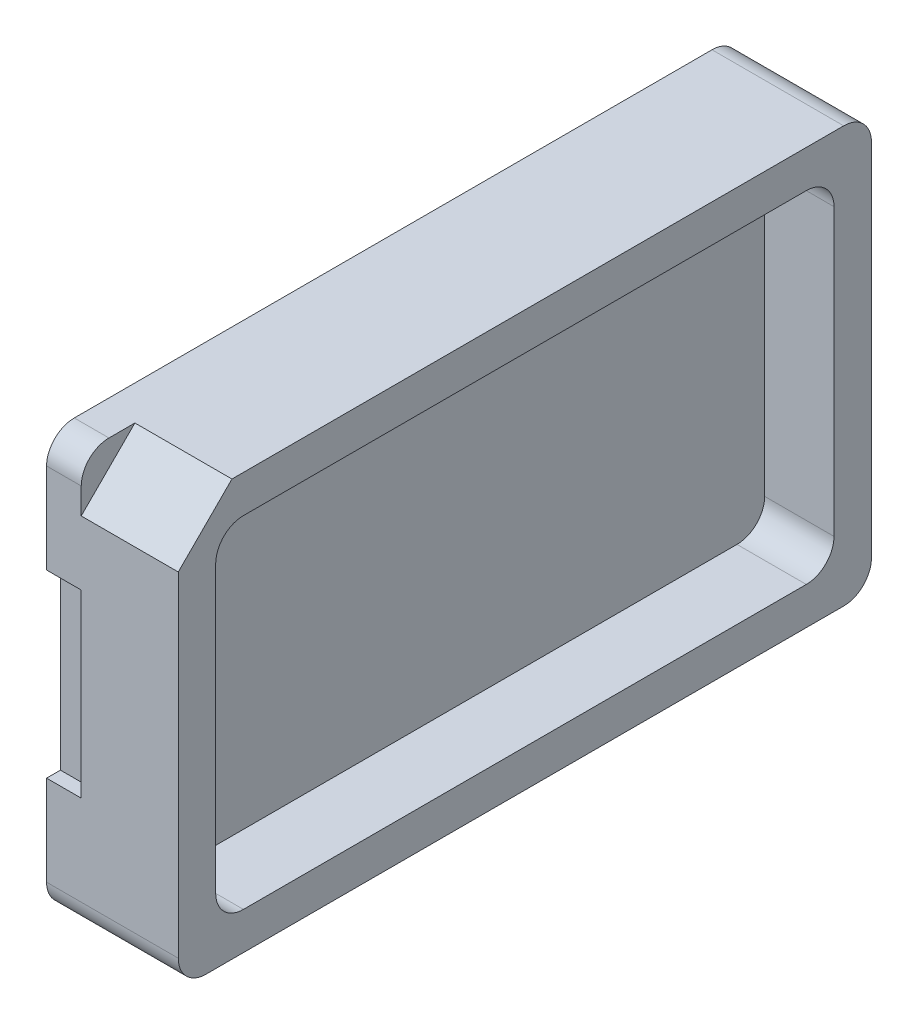
ISO-10303-21;
HEADER;
FILE_DESCRIPTION(('STEP AP214'),'2;1');
FILE_NAME('part.step','',(''),(''),'','','');
FILE_SCHEMA(('AUTOMOTIVE_DESIGN { 1 0 10303 214 1 1 1 1 }'));
ENDSEC;
DATA;
#1=APPLICATION_CONTEXT('core data for automotive mechanical design processes');
#2=APPLICATION_PROTOCOL_DEFINITION('international standard','automotive_design',2000,#1);
#3=PRODUCT_CONTEXT('',#1,'mechanical');
#4=PRODUCT('Part','Part','',(#3));
#5=PRODUCT_RELATED_PRODUCT_CATEGORY('part','',(#4));
#6=PRODUCT_DEFINITION_FORMATION('','',#4);
#7=PRODUCT_DEFINITION_CONTEXT('part definition',#1,'design');
#8=PRODUCT_DEFINITION('design','',#6,#7);
#9=PRODUCT_DEFINITION_SHAPE('','',#8);
#10=(LENGTH_UNIT() NAMED_UNIT(*) SI_UNIT(.MILLI.,.METRE.));
#11=(NAMED_UNIT(*) PLANE_ANGLE_UNIT() SI_UNIT($,.RADIAN.));
#12=(NAMED_UNIT(*) SI_UNIT($,.STERADIAN.) SOLID_ANGLE_UNIT());
#13=UNCERTAINTY_MEASURE_WITH_UNIT(LENGTH_MEASURE(1.E-05),#10,'distance_accuracy_value','');
#14=(GEOMETRIC_REPRESENTATION_CONTEXT(3) GLOBAL_UNCERTAINTY_ASSIGNED_CONTEXT((#13)) GLOBAL_UNIT_ASSIGNED_CONTEXT((#10,
#11,#12)) REPRESENTATION_CONTEXT('',''));
#15=CARTESIAN_POINT('',(0.,0.,0.));
#16=DIRECTION('',(0.,0.,1.));
#17=DIRECTION('',(1.,0.,0.));
#18=AXIS2_PLACEMENT_3D('',#15,#16,#17);
#19=CARTESIAN_POINT('',(0.45,1.03,2.03));
#20=DIRECTION('',(1.,0.,0.));
#21=DIRECTION('',(0.,0.,-1.));
#22=AXIS2_PLACEMENT_3D('',#19,#20,#21);
#23=PLANE('',#22);
#24=CARTESIAN_POINT('',(0.45,1.03,-2.03));
#25=DIRECTION('',(1.,0.,0.));
#26=DIRECTION('',(0.,0.,-1.));
#27=AXIS2_PLACEMENT_3D('',#24,#25,#26);
#28=CIRCLE('',#27,0.2);
#29=CARTESIAN_POINT('',(0.45,1.03,-2.23));
#30=VERTEX_POINT('',#29);
#31=CARTESIAN_POINT('',(0.45,1.23,-2.03));
#32=VERTEX_POINT('',#31);
#33=EDGE_CURVE('E253',#30,#32,#28,.T.);
#34=ORIENTED_EDGE('',*,*,#33,.T.);
#35=DIRECTION('',(0.,0.,-1.));
#36=VECTOR('',#35,1.);
#37=CARTESIAN_POINT('',(0.45,1.23,-2.3));
#38=LINE('',#37,#36);
#39=CARTESIAN_POINT('',(0.45,1.23,2.03));
#40=VERTEX_POINT('',#39);
#41=EDGE_CURVE('E247',#40,#32,#38,.T.);
#42=ORIENTED_EDGE('',*,*,#41,.F.);
#43=CARTESIAN_POINT('',(0.45,1.03,2.03));
#44=DIRECTION('',(1.,0.,0.));
#45=DIRECTION('',(0.,0.,-1.));
#46=AXIS2_PLACEMENT_3D('',#43,#44,#45);
#47=CIRCLE('',#46,0.2);
#48=CARTESIAN_POINT('',(0.45,1.03,2.23));
#49=VERTEX_POINT('',#48);
#50=EDGE_CURVE('E20',#40,#49,#47,.T.);
#51=ORIENTED_EDGE('',*,*,#50,.T.);
#52=DIRECTION('',(0.,1.,0.));
#53=VECTOR('',#52,1.);
#54=CARTESIAN_POINT('',(0.45,-1.3,2.23));
#55=LINE('',#54,#53);
#56=CARTESIAN_POINT('',(0.45,-1.03,2.23));
#57=VERTEX_POINT('',#56);
#58=EDGE_CURVE('E446',#57,#49,#55,.T.);
#59=ORIENTED_EDGE('',*,*,#58,.F.);
#60=CARTESIAN_POINT('',(0.45,-1.03,2.03));
#61=DIRECTION('',(1.,0.,0.));
#62=DIRECTION('',(0.,0.,-1.));
#63=AXIS2_PLACEMENT_3D('',#60,#61,#62);
#64=CIRCLE('',#63,0.2);
#65=CARTESIAN_POINT('',(0.45,-1.23,2.03));
#66=VERTEX_POINT('',#65);
#67=EDGE_CURVE('E342',#57,#66,#64,.T.);
#68=ORIENTED_EDGE('',*,*,#67,.T.);
#69=DIRECTION('',(0.,0.,1.));
#70=VECTOR('',#69,1.);
#71=CARTESIAN_POINT('',(0.45,-1.23,-2.3));
#72=LINE('',#71,#70);
#73=CARTESIAN_POINT('',(0.45,-1.23,-2.03));
#74=VERTEX_POINT('',#73);
#75=EDGE_CURVE('E346',#74,#66,#72,.T.);
#76=ORIENTED_EDGE('',*,*,#75,.F.);
#77=CARTESIAN_POINT('',(0.45,-1.03,-2.03));
#78=DIRECTION('',(1.,0.,0.));
#79=DIRECTION('',(0.,0.,-1.));
#80=AXIS2_PLACEMENT_3D('',#77,#78,#79);
#81=CIRCLE('',#80,0.2);
#82=CARTESIAN_POINT('',(0.45,-1.03,-2.23));
#83=VERTEX_POINT('',#82);
#84=EDGE_CURVE('E347',#74,#83,#81,.T.);
#85=ORIENTED_EDGE('',*,*,#84,.T.);
#86=DIRECTION('',(0.,1.,0.));
#87=VECTOR('',#86,1.);
#88=CARTESIAN_POINT('',(0.45,-1.3,-2.23));
#89=LINE('',#88,#87);
#90=EDGE_CURVE('E258',#30,#83,#89,.F.);
#91=ORIENTED_EDGE('',*,*,#90,.F.);
#92=EDGE_LOOP('',(#34,#42,#51,#59,#68,#76,#85,#91));
#93=FACE_BOUND('',#92,.T.);
#94=ADVANCED_FACE('F17',(#93),#23,.T.);
#95=CARTESIAN_POINT('',(0.45,1.03,2.03));
#96=DIRECTION('',(1.,0.,0.));
#97=DIRECTION('',(0.,0.,-1.));
#98=AXIS2_PLACEMENT_3D('',#95,#96,#97);
#99=CYLINDRICAL_SURFACE('',#98,0.2);
#100=DIRECTION('',(-1.,0.,0.));
#101=VECTOR('',#100,1.);
#102=CARTESIAN_POINT('',(0.45,1.03,2.23));
#103=LINE('',#102,#101);
#104=CARTESIAN_POINT('',(0.95,1.03,2.23));
#105=VERTEX_POINT('',#104);
#106=EDGE_CURVE('E240',#49,#105,#103,.F.);
#107=ORIENTED_EDGE('',*,*,#106,.F.);
#108=ORIENTED_EDGE('',*,*,#50,.F.);
#109=DIRECTION('',(1.,0.,0.));
#110=VECTOR('',#109,1.);
#111=CARTESIAN_POINT('',(0.45,1.23,2.03));
#112=LINE('',#111,#110);
#113=CARTESIAN_POINT('',(0.95,1.23,2.03));
#114=VERTEX_POINT('',#113);
#115=EDGE_CURVE('E238',#114,#40,#112,.F.);
#116=ORIENTED_EDGE('',*,*,#115,.F.);
#117=CARTESIAN_POINT('',(0.95,1.03,2.03));
#118=DIRECTION('',(1.,0.,0.));
#119=DIRECTION('',(0.,0.,-1.));
#120=AXIS2_PLACEMENT_3D('',#117,#118,#119);
#121=CIRCLE('',#120,0.2);
#122=EDGE_CURVE('E335',#105,#114,#121,.F.);
#123=ORIENTED_EDGE('',*,*,#122,.F.);
#124=EDGE_LOOP('',(#107,#108,#116,#123));
#125=FACE_BOUND('',#124,.T.);
#126=ADVANCED_FACE('F236',(#125),#99,.F.);
#127=CARTESIAN_POINT('',(0.45,1.23,-2.3));
#128=DIRECTION('',(0.,-1.,0.));
#129=DIRECTION('',(0.,0.,-1.));
#130=AXIS2_PLACEMENT_3D('',#127,#128,#129);
#131=PLANE('',#130);
#132=ORIENTED_EDGE('',*,*,#41,.T.);
#133=DIRECTION('',(1.,0.,0.));
#134=VECTOR('',#133,1.);
#135=CARTESIAN_POINT('',(0.45,1.23,-2.03));
#136=LINE('',#135,#134);
#137=CARTESIAN_POINT('',(0.95,1.23,-2.03));
#138=VERTEX_POINT('',#137);
#139=EDGE_CURVE('E255',#32,#138,#136,.T.);
#140=ORIENTED_EDGE('',*,*,#139,.T.);
#141=DIRECTION('',(0.,0.,-1.));
#142=VECTOR('',#141,1.);
#143=CARTESIAN_POINT('',(0.95,1.23,-2.3));
#144=LINE('',#143,#142);
#145=EDGE_CURVE('E249',#114,#138,#144,.T.);
#146=ORIENTED_EDGE('',*,*,#145,.F.);
#147=ORIENTED_EDGE('',*,*,#115,.T.);
#148=EDGE_LOOP('',(#132,#140,#146,#147));
#149=FACE_BOUND('',#148,.T.);
#150=ADVANCED_FACE('F245',(#149),#131,.T.);
#151=CARTESIAN_POINT('',(0.45,1.03,-2.03));
#152=DIRECTION('',(1.,0.,0.));
#153=DIRECTION('',(0.,0.,-1.));
#154=AXIS2_PLACEMENT_3D('',#151,#152,#153);
#155=CYLINDRICAL_SURFACE('',#154,0.2);
#156=ORIENTED_EDGE('',*,*,#139,.F.);
#157=ORIENTED_EDGE('',*,*,#33,.F.);
#158=DIRECTION('',(1.,0.,0.));
#159=VECTOR('',#158,1.);
#160=CARTESIAN_POINT('',(0.45,1.03,-2.23));
#161=LINE('',#160,#159);
#162=CARTESIAN_POINT('',(0.95,1.03,-2.23));
#163=VERTEX_POINT('',#162);
#164=EDGE_CURVE('E354',#163,#30,#161,.F.);
#165=ORIENTED_EDGE('',*,*,#164,.F.);
#166=CARTESIAN_POINT('',(0.95,1.03,-2.03));
#167=DIRECTION('',(1.,0.,0.));
#168=DIRECTION('',(0.,0.,-1.));
#169=AXIS2_PLACEMENT_3D('',#166,#167,#168);
#170=CIRCLE('',#169,0.2);
#171=EDGE_CURVE('E333',#138,#163,#170,.F.);
#172=ORIENTED_EDGE('',*,*,#171,.F.);
#173=EDGE_LOOP('',(#156,#157,#165,#172));
#174=FACE_BOUND('',#173,.T.);
#175=ADVANCED_FACE('F742',(#174),#155,.F.);
#176=CARTESIAN_POINT('',(0.45,-1.3,-2.23));
#177=DIRECTION('',(0.,0.,1.));
#178=DIRECTION('',(1.,0.,0.));
#179=AXIS2_PLACEMENT_3D('',#176,#177,#178);
#180=PLANE('',#179);
#181=ORIENTED_EDGE('',*,*,#90,.T.);
#182=DIRECTION('',(1.,0.,0.));
#183=VECTOR('',#182,1.);
#184=CARTESIAN_POINT('',(0.45,-1.03,-2.23));
#185=LINE('',#184,#183);
#186=CARTESIAN_POINT('',(0.95,-1.03,-2.23));
#187=VERTEX_POINT('',#186);
#188=EDGE_CURVE('E349',#83,#187,#185,.T.);
#189=ORIENTED_EDGE('',*,*,#188,.T.);
#190=DIRECTION('',(0.,1.,0.));
#191=VECTOR('',#190,1.);
#192=CARTESIAN_POINT('',(0.95,-1.3,-2.23));
#193=LINE('',#192,#191);
#194=EDGE_CURVE('E332',#163,#187,#193,.F.);
#195=ORIENTED_EDGE('',*,*,#194,.F.);
#196=ORIENTED_EDGE('',*,*,#164,.T.);
#197=EDGE_LOOP('',(#181,#189,#195,#196));
#198=FACE_BOUND('',#197,.T.);
#199=ADVANCED_FACE('F738',(#198),#180,.T.);
#200=CARTESIAN_POINT('',(0.45,-1.03,-2.03));
#201=DIRECTION('',(1.,0.,0.));
#202=DIRECTION('',(0.,0.,-1.));
#203=AXIS2_PLACEMENT_3D('',#200,#201,#202);
#204=CYLINDRICAL_SURFACE('',#203,0.2);
#205=ORIENTED_EDGE('',*,*,#188,.F.);
#206=ORIENTED_EDGE('',*,*,#84,.F.);
#207=DIRECTION('',(1.,0.,0.));
#208=VECTOR('',#207,1.);
#209=CARTESIAN_POINT('',(0.45,-1.23,-2.03));
#210=LINE('',#209,#208);
#211=CARTESIAN_POINT('',(0.95,-1.23,-2.03));
#212=VERTEX_POINT('',#211);
#213=EDGE_CURVE('E352',#212,#74,#210,.F.);
#214=ORIENTED_EDGE('',*,*,#213,.F.);
#215=CARTESIAN_POINT('',(0.95,-1.03,-2.03));
#216=DIRECTION('',(1.,0.,0.));
#217=DIRECTION('',(0.,0.,-1.));
#218=AXIS2_PLACEMENT_3D('',#215,#216,#217);
#219=CIRCLE('',#218,0.2);
#220=EDGE_CURVE('E330',#187,#212,#219,.F.);
#221=ORIENTED_EDGE('',*,*,#220,.F.);
#222=EDGE_LOOP('',(#205,#206,#214,#221));
#223=FACE_BOUND('',#222,.T.);
#224=ADVANCED_FACE('F735',(#223),#204,.F.);
#225=CARTESIAN_POINT('',(0.45,-1.23,-2.3));
#226=DIRECTION('',(0.,1.,0.));
#227=DIRECTION('',(0.,0.,1.));
#228=AXIS2_PLACEMENT_3D('',#225,#226,#227);
#229=PLANE('',#228);
#230=ORIENTED_EDGE('',*,*,#75,.T.);
#231=DIRECTION('',(1.,0.,0.));
#232=VECTOR('',#231,1.);
#233=CARTESIAN_POINT('',(0.45,-1.23,2.03));
#234=LINE('',#233,#232);
#235=CARTESIAN_POINT('',(0.95,-1.23,2.03));
#236=VERTEX_POINT('',#235);
#237=EDGE_CURVE('E345',#66,#236,#234,.T.);
#238=ORIENTED_EDGE('',*,*,#237,.T.);
#239=DIRECTION('',(0.,0.,-1.));
#240=VECTOR('',#239,1.);
#241=CARTESIAN_POINT('',(0.95,-1.23,-2.3));
#242=LINE('',#241,#240);
#243=EDGE_CURVE('E329',#212,#236,#242,.F.);
#244=ORIENTED_EDGE('',*,*,#243,.F.);
#245=ORIENTED_EDGE('',*,*,#213,.T.);
#246=EDGE_LOOP('',(#230,#238,#244,#245));
#247=FACE_BOUND('',#246,.T.);
#248=ADVANCED_FACE('F729',(#247),#229,.T.);
#249=CARTESIAN_POINT('',(0.45,-1.03,2.03));
#250=DIRECTION('',(1.,0.,0.));
#251=DIRECTION('',(0.,0.,-1.));
#252=AXIS2_PLACEMENT_3D('',#249,#250,#251);
#253=CYLINDRICAL_SURFACE('',#252,0.2);
#254=ORIENTED_EDGE('',*,*,#237,.F.);
#255=ORIENTED_EDGE('',*,*,#67,.F.);
#256=DIRECTION('',(-1.,0.,0.));
#257=VECTOR('',#256,1.);
#258=CARTESIAN_POINT('',(0.45,-1.03,2.23));
#259=LINE('',#258,#257);
#260=CARTESIAN_POINT('',(0.95,-1.03,2.23));
#261=VERTEX_POINT('',#260);
#262=EDGE_CURVE('E448',#261,#57,#259,.T.);
#263=ORIENTED_EDGE('',*,*,#262,.F.);
#264=CARTESIAN_POINT('',(0.95,-1.03,2.03));
#265=DIRECTION('',(1.,0.,0.));
#266=DIRECTION('',(0.,0.,-1.));
#267=AXIS2_PLACEMENT_3D('',#264,#265,#266);
#268=CIRCLE('',#267,0.2);
#269=EDGE_CURVE('E326',#236,#261,#268,.F.);
#270=ORIENTED_EDGE('',*,*,#269,.F.);
#271=EDGE_LOOP('',(#254,#255,#263,#270));
#272=FACE_BOUND('',#271,.T.);
#273=ADVANCED_FACE('F719',(#272),#253,.F.);
#274=CARTESIAN_POINT('',(0.45,-1.3,2.23));
#275=DIRECTION('',(0.,0.,-1.));
#276=DIRECTION('',(-1.,0.,0.));
#277=AXIS2_PLACEMENT_3D('',#274,#275,#276);
#278=PLANE('',#277);
#279=ORIENTED_EDGE('',*,*,#58,.T.);
#280=ORIENTED_EDGE('',*,*,#106,.T.);
#281=DIRECTION('',(0.,1.,0.));
#282=VECTOR('',#281,1.);
#283=CARTESIAN_POINT('',(0.95,-1.3,2.23));
#284=LINE('',#283,#282);
#285=EDGE_CURVE('E328',#261,#105,#284,.T.);
#286=ORIENTED_EDGE('',*,*,#285,.F.);
#287=ORIENTED_EDGE('',*,*,#262,.T.);
#288=EDGE_LOOP('',(#279,#280,#286,#287));
#289=FACE_BOUND('',#288,.T.);
#290=ADVANCED_FACE('F721',(#289),#278,.T.);
#291=CARTESIAN_POINT('',(0.95,-1.3,2.5));
#292=DIRECTION('',(0.,0.,-1.));
#293=DIRECTION('',(-1.,0.,0.));
#294=AXIS2_PLACEMENT_3D('',#291,#292,#293);
#295=PLANE('',#294);
#296=DIRECTION('',(0.,1.,0.));
#297=VECTOR('',#296,1.);
#298=CARTESIAN_POINT('',(0.,-1.3,2.5));
#299=LINE('',#298,#297);
#300=CARTESIAN_POINT('',(0.,-1.3,2.5));
#301=VERTEX_POINT('',#300);
#302=CARTESIAN_POINT('',(0.,-0.65,2.5));
#303=VERTEX_POINT('',#302);
#304=EDGE_CURVE('E394',#301,#303,#299,.T.);
#305=ORIENTED_EDGE('',*,*,#304,.F.);
#306=DIRECTION('',(-1.,0.,0.));
#307=VECTOR('',#306,1.);
#308=CARTESIAN_POINT('',(0.95,-1.3,2.5));
#309=LINE('',#308,#307);
#310=CARTESIAN_POINT('',(0.95,-1.3,2.5));
#311=VERTEX_POINT('',#310);
#312=EDGE_CURVE('E397',#311,#301,#309,.T.);
#313=ORIENTED_EDGE('',*,*,#312,.F.);
#314=DIRECTION('',(0.,1.,0.));
#315=VECTOR('',#314,1.);
#316=CARTESIAN_POINT('',(0.95,-1.3,2.5));
#317=LINE('',#316,#315);
#318=CARTESIAN_POINT('',(0.95,1.112842712475,2.5));
#319=VERTEX_POINT('',#318);
#320=EDGE_CURVE('E505',#319,#311,#317,.F.);
#321=ORIENTED_EDGE('',*,*,#320,.F.);
#322=DIRECTION('',(-1.,0.,0.));
#323=VECTOR('',#322,1.);
#324=CARTESIAN_POINT('',(0.95,1.112842712475,2.5));
#325=LINE('',#324,#323);
#326=CARTESIAN_POINT('',(0.25,1.112842712475,2.5));
#327=VERTEX_POINT('',#326);
#328=EDGE_CURVE('E409',#327,#319,#325,.F.);
#329=ORIENTED_EDGE('',*,*,#328,.F.);
#330=DIRECTION('',(0.,1.,0.));
#331=VECTOR('',#330,1.);
#332=CARTESIAN_POINT('',(0.25,-1.3,2.5));
#333=LINE('',#332,#331);
#334=CARTESIAN_POINT('',(0.25,1.3,2.5));
#335=VERTEX_POINT('',#334);
#336=EDGE_CURVE('E406',#335,#327,#333,.F.);
#337=ORIENTED_EDGE('',*,*,#336,.F.);
#338=DIRECTION('',(-1.,0.,0.));
#339=VECTOR('',#338,1.);
#340=CARTESIAN_POINT('',(0.95,1.3,2.5));
#341=LINE('',#340,#339);
#342=CARTESIAN_POINT('',(0.,1.3,2.5));
#343=VERTEX_POINT('',#342);
#344=EDGE_CURVE('E410',#343,#335,#341,.F.);
#345=ORIENTED_EDGE('',*,*,#344,.F.);
#346=DIRECTION('',(0.,1.,0.));
#347=VECTOR('',#346,1.);
#348=CARTESIAN_POINT('',(0.,-1.3,2.5));
#349=LINE('',#348,#347);
#350=CARTESIAN_POINT('',(0.,0.65,2.5));
#351=VERTEX_POINT('',#350);
#352=EDGE_CURVE('E415',#351,#343,#349,.T.);
#353=ORIENTED_EDGE('',*,*,#352,.F.);
#354=DIRECTION('',(-1.,0.,0.));
#355=VECTOR('',#354,1.);
#356=CARTESIAN_POINT('',(0.95,0.65,2.5));
#357=LINE('',#356,#355);
#358=CARTESIAN_POINT('',(0.25,0.65,2.5));
#359=VERTEX_POINT('',#358);
#360=EDGE_CURVE('E418',#359,#351,#357,.T.);
#361=ORIENTED_EDGE('',*,*,#360,.F.);
#362=DIRECTION('',(0.,1.,0.));
#363=VECTOR('',#362,1.);
#364=CARTESIAN_POINT('',(0.25,-1.3,2.5));
#365=LINE('',#364,#363);
#366=CARTESIAN_POINT('',(0.25,-0.65,2.5));
#367=VERTEX_POINT('',#366);
#368=EDGE_CURVE('E427',#367,#359,#365,.T.);
#369=ORIENTED_EDGE('',*,*,#368,.F.);
#370=DIRECTION('',(-1.,0.,0.));
#371=VECTOR('',#370,1.);
#372=CARTESIAN_POINT('',(0.95,-0.65,2.5));
#373=LINE('',#372,#371);
#374=EDGE_CURVE('E383',#303,#367,#373,.F.);
#375=ORIENTED_EDGE('',*,*,#374,.F.);
#376=EDGE_LOOP('',(#305,#313,#321,#329,#337,#345,#353,#361,#369,#375));
#377=FACE_BOUND('',#376,.T.);
#378=ADVANCED_FACE('F575',(#377),#295,.F.);
#379=CARTESIAN_POINT('',(0.95,-1.3,-2.5));
#380=DIRECTION('',(0.,0.,1.));
#381=DIRECTION('',(1.,0.,0.));
#382=AXIS2_PLACEMENT_3D('',#379,#380,#381);
#383=PLANE('',#382);
#384=DIRECTION('',(0.,1.,0.));
#385=VECTOR('',#384,1.);
#386=CARTESIAN_POINT('',(0.25,0.,-2.5));
#387=LINE('',#386,#385);
#388=CARTESIAN_POINT('',(0.25,-0.65,-2.5));
#389=VERTEX_POINT('',#388);
#390=CARTESIAN_POINT('',(0.25,0.65,-2.5));
#391=VERTEX_POINT('',#390);
#392=EDGE_CURVE('E340',#389,#391,#387,.T.);
#393=ORIENTED_EDGE('',*,*,#392,.T.);
#394=DIRECTION('',(1.,0.,0.));
#395=VECTOR('',#394,1.);
#396=CARTESIAN_POINT('',(0.95,0.65,-2.5));
#397=LINE('',#396,#395);
#398=CARTESIAN_POINT('',(0.,0.65,-2.5));
#399=VERTEX_POINT('',#398);
#400=EDGE_CURVE('E367',#399,#391,#397,.T.);
#401=ORIENTED_EDGE('',*,*,#400,.F.);
#402=DIRECTION('',(0.,1.,0.));
#403=VECTOR('',#402,1.);
#404=CARTESIAN_POINT('',(0.,-1.3,-2.5));
#405=LINE('',#404,#403);
#406=CARTESIAN_POINT('',(0.,1.3,-2.5));
#407=VERTEX_POINT('',#406);
#408=EDGE_CURVE('E364',#407,#399,#405,.F.);
#409=ORIENTED_EDGE('',*,*,#408,.F.);
#410=DIRECTION('',(1.,0.,0.));
#411=VECTOR('',#410,1.);
#412=CARTESIAN_POINT('',(0.95,1.3,-2.5));
#413=LINE('',#412,#411);
#414=CARTESIAN_POINT('',(0.95,1.3,-2.5));
#415=VERTEX_POINT('',#414);
#416=EDGE_CURVE('E368',#415,#407,#413,.F.);
#417=ORIENTED_EDGE('',*,*,#416,.F.);
#418=DIRECTION('',(0.,1.,0.));
#419=VECTOR('',#418,1.);
#420=CARTESIAN_POINT('',(0.95,-1.3,-2.5));
#421=LINE('',#420,#419);
#422=CARTESIAN_POINT('',(0.95,-1.3,-2.5));
#423=VERTEX_POINT('',#422);
#424=EDGE_CURVE('E489',#423,#415,#421,.T.);
#425=ORIENTED_EDGE('',*,*,#424,.F.);
#426=DIRECTION('',(1.,0.,0.));
#427=VECTOR('',#426,1.);
#428=CARTESIAN_POINT('',(0.95,-1.3,-2.5));
#429=LINE('',#428,#427);
#430=CARTESIAN_POINT('',(0.,-1.3,-2.5));
#431=VERTEX_POINT('',#430);
#432=EDGE_CURVE('E382',#431,#423,#429,.T.);
#433=ORIENTED_EDGE('',*,*,#432,.F.);
#434=DIRECTION('',(0.,1.,0.));
#435=VECTOR('',#434,1.);
#436=CARTESIAN_POINT('',(0.,-1.3,-2.5));
#437=LINE('',#436,#435);
#438=CARTESIAN_POINT('',(0.,-0.65,-2.5));
#439=VERTEX_POINT('',#438);
#440=EDGE_CURVE('E379',#439,#431,#437,.F.);
#441=ORIENTED_EDGE('',*,*,#440,.F.);
#442=DIRECTION('',(1.,0.,0.));
#443=VECTOR('',#442,1.);
#444=CARTESIAN_POINT('',(0.95,-0.65,-2.5));
#445=LINE('',#444,#443);
#446=EDGE_CURVE('E341',#389,#439,#445,.F.);
#447=ORIENTED_EDGE('',*,*,#446,.F.);
#448=EDGE_LOOP('',(#393,#401,#409,#417,#425,#433,#441,#447));
#449=FACE_BOUND('',#448,.T.);
#450=ADVANCED_FACE('F592',(#449),#383,.F.);
#451=CARTESIAN_POINT('',(0.25,-0.345,0.4));
#452=DIRECTION('',(-1.,0.,0.));
#453=DIRECTION('',(0.,0.,1.));
#454=AXIS2_PLACEMENT_3D('',#451,#452,#453);
#455=PLANE('',#454);
#456=CARTESIAN_POINT('',(0.25,-0.345,-1.3));
#457=DIRECTION('',(-1.,0.,0.));
#458=DIRECTION('',(0.,0.,1.));
#459=AXIS2_PLACEMENT_3D('',#456,#457,#458);
#460=CIRCLE('',#459,0.2);
#461=CARTESIAN_POINT('',(0.25,-0.345,-1.5));
#462=VERTEX_POINT('',#461);
#463=CARTESIAN_POINT('',(0.25,-0.545,-1.3));
#464=VERTEX_POINT('',#463);
#465=EDGE_CURVE('E311',#462,#464,#460,.T.);
#466=ORIENTED_EDGE('',*,*,#465,.T.);
#467=DIRECTION('',(0.,0.,1.));
#468=VECTOR('',#467,1.);
#469=CARTESIAN_POINT('',(0.25,-0.545,-1.3));
#470=LINE('',#469,#468);
#471=CARTESIAN_POINT('',(0.25,-0.545,0.4));
#472=VERTEX_POINT('',#471);
#473=EDGE_CURVE('E314',#472,#464,#470,.F.);
#474=ORIENTED_EDGE('',*,*,#473,.F.);
#475=CARTESIAN_POINT('',(0.25,-0.345,0.4));
#476=DIRECTION('',(-1.,0.,0.));
#477=DIRECTION('',(0.,0.,1.));
#478=AXIS2_PLACEMENT_3D('',#475,#476,#477);
#479=CIRCLE('',#478,0.2);
#480=CARTESIAN_POINT('',(0.25,-0.345,0.6));
#481=VERTEX_POINT('',#480);
#482=EDGE_CURVE('E338',#472,#481,#479,.T.);
#483=ORIENTED_EDGE('',*,*,#482,.T.);
#484=DIRECTION('',(0.,1.,0.));
#485=VECTOR('',#484,1.);
#486=CARTESIAN_POINT('',(0.25,-0.345,0.6));
#487=LINE('',#486,#485);
#488=CARTESIAN_POINT('',(0.25,0.545,0.6));
#489=VERTEX_POINT('',#488);
#490=EDGE_CURVE('E442',#489,#481,#487,.F.);
#491=ORIENTED_EDGE('',*,*,#490,.F.);
#492=CARTESIAN_POINT('',(0.25,0.545,0.4));
#493=DIRECTION('',(-1.,0.,0.));
#494=DIRECTION('',(0.,0.,1.));
#495=AXIS2_PLACEMENT_3D('',#492,#493,#494);
#496=CIRCLE('',#495,0.2);
#497=CARTESIAN_POINT('',(0.25,0.745,0.4));
#498=VERTEX_POINT('',#497);
#499=EDGE_CURVE('E321',#489,#498,#496,.T.);
#500=ORIENTED_EDGE('',*,*,#499,.T.);
#501=DIRECTION('',(0.,0.,-1.));
#502=VECTOR('',#501,1.);
#503=CARTESIAN_POINT('',(0.25,0.745,-1.3));
#504=LINE('',#503,#502);
#505=CARTESIAN_POINT('',(0.25,0.745,-1.3));
#506=VERTEX_POINT('',#505);
#507=EDGE_CURVE('E324',#506,#498,#504,.F.);
#508=ORIENTED_EDGE('',*,*,#507,.F.);
#509=CARTESIAN_POINT('',(0.25,0.545,-1.3));
#510=DIRECTION('',(-1.,0.,0.));
#511=DIRECTION('',(0.,0.,1.));
#512=AXIS2_PLACEMENT_3D('',#509,#510,#511);
#513=CIRCLE('',#512,0.2);
#514=CARTESIAN_POINT('',(0.25,0.545,-1.5));
#515=VERTEX_POINT('',#514);
#516=EDGE_CURVE('E316',#506,#515,#513,.T.);
#517=ORIENTED_EDGE('',*,*,#516,.T.);
#518=DIRECTION('',(0.,1.,0.));
#519=VECTOR('',#518,1.);
#520=CARTESIAN_POINT('',(0.25,-0.345,-1.5));
#521=LINE('',#520,#519);
#522=EDGE_CURVE('E319',#462,#515,#521,.T.);
#523=ORIENTED_EDGE('',*,*,#522,.F.);
#524=EDGE_LOOP('',(#466,#474,#483,#491,#500,#508,#517,#523));
#525=FACE_BOUND('',#524,.T.);
#526=ADVANCED_FACE('F611',(#525),#455,.T.);
#527=CARTESIAN_POINT('',(0.25,0.,0.));
#528=DIRECTION('',(1.,0.,0.));
#529=DIRECTION('',(0.,0.,-1.));
#530=AXIS2_PLACEMENT_3D('',#527,#528,#529);
#531=PLANE('',#530);
#532=DIRECTION('',(0.,1.,0.));
#533=VECTOR('',#532,1.);
#534=CARTESIAN_POINT('',(0.25,-0.65,-2.4));
#535=LINE('',#534,#533);
#536=CARTESIAN_POINT('',(0.25,0.65,-2.4));
#537=VERTEX_POINT('',#536);
#538=CARTESIAN_POINT('',(0.25,-0.65,-2.4));
#539=VERTEX_POINT('',#538);
#540=EDGE_CURVE('E536',#537,#539,#535,.F.);
#541=ORIENTED_EDGE('',*,*,#540,.F.);
#542=DIRECTION('',(0.,0.,-1.));
#543=VECTOR('',#542,1.);
#544=CARTESIAN_POINT('',(0.25,0.65,0.));
#545=LINE('',#544,#543);
#546=EDGE_CURVE('E337',#391,#537,#545,.F.);
#547=ORIENTED_EDGE('',*,*,#546,.F.);
#548=ORIENTED_EDGE('',*,*,#392,.F.);
#549=DIRECTION('',(0.,0.,1.));
#550=VECTOR('',#549,1.);
#551=CARTESIAN_POINT('',(0.25,-0.65,-2.8));
#552=LINE('',#551,#550);
#553=EDGE_CURVE('E533',#539,#389,#552,.F.);
#554=ORIENTED_EDGE('',*,*,#553,.F.);
#555=EDGE_LOOP('',(#541,#547,#548,#554));
#556=FACE_BOUND('',#555,.T.);
#557=ADVANCED_FACE('F608',(#556),#531,.F.);
#558=CARTESIAN_POINT('',(0.95,-1.3,-2.3));
#559=DIRECTION('',(1.,0.,0.));
#560=DIRECTION('',(0.,0.,-1.));
#561=AXIS2_PLACEMENT_3D('',#558,#559,#560);
#562=PLANE('',#561);
#563=ORIENTED_EDGE('',*,*,#424,.T.);
#564=CARTESIAN_POINT('',(0.95,1.3,-2.3));
#565=DIRECTION('',(-1.,0.,0.));
#566=DIRECTION('',(0.,0.,1.));
#567=AXIS2_PLACEMENT_3D('',#564,#565,#566);
#568=CIRCLE('',#567,0.2);
#569=CARTESIAN_POINT('',(0.95,1.5,-2.3));
#570=VERTEX_POINT('',#569);
#571=EDGE_CURVE('E297',#570,#415,#568,.T.);
#572=ORIENTED_EDGE('',*,*,#571,.F.);
#573=DIRECTION('',(0.,0.,-1.));
#574=VECTOR('',#573,1.);
#575=CARTESIAN_POINT('',(0.95,1.5,2.3));
#576=LINE('',#575,#574);
#577=CARTESIAN_POINT('',(0.95,1.5,2.112842712475));
#578=VERTEX_POINT('',#577);
#579=EDGE_CURVE('E494',#570,#578,#576,.F.);
#580=ORIENTED_EDGE('',*,*,#579,.T.);
#581=DIRECTION('',(0.,-0.707106781186548,0.707106781186548));
#582=VECTOR('',#581,1.);
#583=CARTESIAN_POINT('',(0.95,1.112842712475,2.5));
#584=LINE('',#583,#582);
#585=EDGE_CURVE('E485',#319,#578,#584,.F.);
#586=ORIENTED_EDGE('',*,*,#585,.F.);
#587=ORIENTED_EDGE('',*,*,#320,.T.);
#588=CARTESIAN_POINT('',(0.95,-1.3,2.3));
#589=DIRECTION('',(-1.,0.,0.));
#590=DIRECTION('',(0.,0.,1.));
#591=AXIS2_PLACEMENT_3D('',#588,#589,#590);
#592=CIRCLE('',#591,0.2);
#593=CARTESIAN_POINT('',(0.95,-1.5,2.3));
#594=VERTEX_POINT('',#593);
#595=EDGE_CURVE('E306',#594,#311,#592,.T.);
#596=ORIENTED_EDGE('',*,*,#595,.F.);
#597=DIRECTION('',(0.,0.,1.));
#598=VECTOR('',#597,1.);
#599=CARTESIAN_POINT('',(0.95,-1.5,2.3));
#600=LINE('',#599,#598);
#601=CARTESIAN_POINT('',(0.95,-1.5,-2.3));
#602=VERTEX_POINT('',#601);
#603=EDGE_CURVE('E305',#594,#602,#600,.F.);
#604=ORIENTED_EDGE('',*,*,#603,.T.);
#605=CARTESIAN_POINT('',(0.95,-1.3,-2.3));
#606=DIRECTION('',(-1.,0.,0.));
#607=DIRECTION('',(0.,0.,1.));
#608=AXIS2_PLACEMENT_3D('',#605,#606,#607);
#609=CIRCLE('',#608,0.2);
#610=EDGE_CURVE('E302',#423,#602,#609,.T.);
#611=ORIENTED_EDGE('',*,*,#610,.F.);
#612=EDGE_LOOP('',(#563,#572,#580,#586,#587,#596,#604,#611));
#613=FACE_BOUND('',#612,.T.);
#614=ORIENTED_EDGE('',*,*,#269,.T.);
#615=ORIENTED_EDGE('',*,*,#285,.T.);
#616=ORIENTED_EDGE('',*,*,#122,.T.);
#617=ORIENTED_EDGE('',*,*,#145,.T.);
#618=ORIENTED_EDGE('',*,*,#171,.T.);
#619=ORIENTED_EDGE('',*,*,#194,.T.);
#620=ORIENTED_EDGE('',*,*,#220,.T.);
#621=ORIENTED_EDGE('',*,*,#243,.T.);
#622=EDGE_LOOP('',(#614,#615,#616,#617,#618,#619,#620,#621));
#623=FACE_BOUND('',#622,.T.);
#624=ADVANCED_FACE('F610',(#613,#623),#562,.T.);
#625=CARTESIAN_POINT('',(0.95,1.112842712475,2.5));
#626=DIRECTION('',(0.,0.707106781186548,0.707106781186548));
#627=DIRECTION('',(0.,-0.707106781186548,0.707106781186548));
#628=AXIS2_PLACEMENT_3D('',#625,#626,#627);
#629=PLANE('',#628);
#630=ORIENTED_EDGE('',*,*,#585,.T.);
#631=DIRECTION('',(1.,0.,0.));
#632=VECTOR('',#631,1.);
#633=CARTESIAN_POINT('',(0.95,1.5,2.112842712475));
#634=LINE('',#633,#632);
#635=CARTESIAN_POINT('',(0.25,1.5,2.112842712475));
#636=VERTEX_POINT('',#635);
#637=EDGE_CURVE('E296',#578,#636,#634,.F.);
#638=ORIENTED_EDGE('',*,*,#637,.T.);
#639=DIRECTION('',(0.,-0.707106781186548,0.707106781186547));
#640=VECTOR('',#639,1.);
#641=CARTESIAN_POINT('',(0.25,1.5,2.112842712475));
#642=LINE('',#641,#640);
#643=EDGE_CURVE('E443',#636,#327,#642,.T.);
#644=ORIENTED_EDGE('',*,*,#643,.T.);
#645=ORIENTED_EDGE('',*,*,#328,.T.);
#646=EDGE_LOOP('',(#630,#638,#644,#645));
#647=FACE_BOUND('',#646,.T.);
#648=ADVANCED_FACE('F618',(#647),#629,.T.);
#649=CARTESIAN_POINT('',(0.25,0.,0.));
#650=DIRECTION('',(-1.,0.,0.));
#651=DIRECTION('',(0.,0.,1.));
#652=AXIS2_PLACEMENT_3D('',#649,#650,#651);
#653=PLANE('',#652);
#654=ORIENTED_EDGE('',*,*,#336,.T.);
#655=ORIENTED_EDGE('',*,*,#643,.F.);
#656=DIRECTION('',(0.,0.,-1.));
#657=VECTOR('',#656,1.);
#658=CARTESIAN_POINT('',(0.25,1.5,2.3));
#659=LINE('',#658,#657);
#660=CARTESIAN_POINT('',(0.25,1.5,2.3));
#661=VERTEX_POINT('',#660);
#662=EDGE_CURVE('E300',#636,#661,#659,.F.);
#663=ORIENTED_EDGE('',*,*,#662,.T.);
#664=CARTESIAN_POINT('',(0.25,1.3,2.3));
#665=DIRECTION('',(-1.,0.,0.));
#666=DIRECTION('',(0.,0.,1.));
#667=AXIS2_PLACEMENT_3D('',#664,#665,#666);
#668=CIRCLE('',#667,0.2);
#669=EDGE_CURVE('E293',#335,#661,#668,.T.);
#670=ORIENTED_EDGE('',*,*,#669,.F.);
#671=EDGE_LOOP('',(#654,#655,#663,#670));
#672=FACE_BOUND('',#671,.T.);
#673=ADVANCED_FACE('F695',(#672),#653,.F.);
#674=CARTESIAN_POINT('',(0.25,0.,0.));
#675=DIRECTION('',(1.,0.,0.));
#676=DIRECTION('',(0.,0.,-1.));
#677=AXIS2_PLACEMENT_3D('',#674,#675,#676);
#678=PLANE('',#677);
#679=DIRECTION('',(0.,1.,0.));
#680=VECTOR('',#679,1.);
#681=CARTESIAN_POINT('',(0.25,-0.65,2.4));
#682=LINE('',#681,#680);
#683=CARTESIAN_POINT('',(0.25,-0.65,2.4));
#684=VERTEX_POINT('',#683);
#685=CARTESIAN_POINT('',(0.25,0.65,2.4));
#686=VERTEX_POINT('',#685);
#687=EDGE_CURVE('E433',#684,#686,#682,.T.);
#688=ORIENTED_EDGE('',*,*,#687,.F.);
#689=DIRECTION('',(0.,0.,-1.));
#690=VECTOR('',#689,1.);
#691=CARTESIAN_POINT('',(0.25,-0.65,0.));
#692=LINE('',#691,#690);
#693=EDGE_CURVE('E440',#367,#684,#692,.T.);
#694=ORIENTED_EDGE('',*,*,#693,.F.);
#695=ORIENTED_EDGE('',*,*,#368,.T.);
#696=DIRECTION('',(0.,0.,-1.));
#697=VECTOR('',#696,1.);
#698=CARTESIAN_POINT('',(0.25,0.65,2.4));
#699=LINE('',#698,#697);
#700=EDGE_CURVE('E430',#686,#359,#699,.F.);
#701=ORIENTED_EDGE('',*,*,#700,.F.);
#702=EDGE_LOOP('',(#688,#694,#695,#701));
#703=FACE_BOUND('',#702,.T.);
#704=ADVANCED_FACE('F691',(#703),#678,.F.);
#705=CARTESIAN_POINT('',(0.25,-0.345,0.6));
#706=DIRECTION('',(0.,0.,-1.));
#707=DIRECTION('',(-1.,0.,0.));
#708=AXIS2_PLACEMENT_3D('',#705,#706,#707);
#709=PLANE('',#708);
#710=ORIENTED_EDGE('',*,*,#490,.T.);
#711=DIRECTION('',(-1.,0.,0.));
#712=VECTOR('',#711,1.);
#713=CARTESIAN_POINT('',(0.25,-0.345,0.6));
#714=LINE('',#713,#712);
#715=CARTESIAN_POINT('',(0.,-0.345,0.6));
#716=VERTEX_POINT('',#715);
#717=EDGE_CURVE('E310',#481,#716,#714,.T.);
#718=ORIENTED_EDGE('',*,*,#717,.T.);
#719=DIRECTION('',(0.,1.,0.));
#720=VECTOR('',#719,1.);
#721=CARTESIAN_POINT('',(0.,-1.3,0.6));
#722=LINE('',#721,#720);
#723=CARTESIAN_POINT('',(0.,0.545,0.6));
#724=VERTEX_POINT('',#723);
#725=EDGE_CURVE('E292',#716,#724,#722,.T.);
#726=ORIENTED_EDGE('',*,*,#725,.T.);
#727=DIRECTION('',(-1.,0.,0.));
#728=VECTOR('',#727,1.);
#729=CARTESIAN_POINT('',(0.25,0.545,0.6));
#730=LINE('',#729,#728);
#731=EDGE_CURVE('E325',#724,#489,#730,.F.);
#732=ORIENTED_EDGE('',*,*,#731,.T.);
#733=EDGE_LOOP('',(#710,#718,#726,#732));
#734=FACE_BOUND('',#733,.T.);
#735=ADVANCED_FACE('F687',(#734),#709,.T.);
#736=CARTESIAN_POINT('',(0.25,0.545,0.4));
#737=DIRECTION('',(-1.,0.,0.));
#738=DIRECTION('',(0.,0.,1.));
#739=AXIS2_PLACEMENT_3D('',#736,#737,#738);
#740=CYLINDRICAL_SURFACE('',#739,0.2);
#741=DIRECTION('',(1.,0.,0.));
#742=VECTOR('',#741,1.);
#743=CARTESIAN_POINT('',(0.25,0.745,0.4));
#744=LINE('',#743,#742);
#745=CARTESIAN_POINT('',(0.,0.745,0.4));
#746=VERTEX_POINT('',#745);
#747=EDGE_CURVE('E469',#498,#746,#744,.F.);
#748=ORIENTED_EDGE('',*,*,#747,.F.);
#749=ORIENTED_EDGE('',*,*,#499,.F.);
#750=ORIENTED_EDGE('',*,*,#731,.F.);
#751=CARTESIAN_POINT('',(0.,0.545,0.4));
#752=DIRECTION('',(-1.,0.,0.));
#753=DIRECTION('',(0.,0.,1.));
#754=AXIS2_PLACEMENT_3D('',#751,#752,#753);
#755=CIRCLE('',#754,0.2);
#756=EDGE_CURVE('E289',#724,#746,#755,.T.);
#757=ORIENTED_EDGE('',*,*,#756,.T.);
#758=EDGE_LOOP('',(#748,#749,#750,#757));
#759=FACE_BOUND('',#758,.T.);
#760=ADVANCED_FACE('F683',(#759),#740,.F.);
#761=CARTESIAN_POINT('',(0.25,0.745,-1.3));
#762=DIRECTION('',(0.,-1.,0.));
#763=DIRECTION('',(0.,0.,-1.));
#764=AXIS2_PLACEMENT_3D('',#761,#762,#763);
#765=PLANE('',#764);
#766=ORIENTED_EDGE('',*,*,#507,.T.);
#767=ORIENTED_EDGE('',*,*,#747,.T.);
#768=DIRECTION('',(0.,0.,-1.));
#769=VECTOR('',#768,1.);
#770=CARTESIAN_POINT('',(0.,0.745,-2.3));
#771=LINE('',#770,#769);
#772=CARTESIAN_POINT('',(0.,0.745,-1.3));
#773=VERTEX_POINT('',#772);
#774=EDGE_CURVE('E288',#746,#773,#771,.T.);
#775=ORIENTED_EDGE('',*,*,#774,.T.);
#776=DIRECTION('',(-1.,0.,0.));
#777=VECTOR('',#776,1.);
#778=CARTESIAN_POINT('',(0.25,0.745,-1.3));
#779=LINE('',#778,#777);
#780=EDGE_CURVE('E320',#773,#506,#779,.F.);
#781=ORIENTED_EDGE('',*,*,#780,.T.);
#782=EDGE_LOOP('',(#766,#767,#775,#781));
#783=FACE_BOUND('',#782,.T.);
#784=ADVANCED_FACE('F679',(#783),#765,.T.);
#785=CARTESIAN_POINT('',(0.25,0.545,-1.3));
#786=DIRECTION('',(-1.,0.,0.));
#787=DIRECTION('',(0.,0.,1.));
#788=AXIS2_PLACEMENT_3D('',#785,#786,#787);
#789=CYLINDRICAL_SURFACE('',#788,0.2);
#790=DIRECTION('',(1.,0.,0.));
#791=VECTOR('',#790,1.);
#792=CARTESIAN_POINT('',(0.25,0.545,-1.5));
#793=LINE('',#792,#791);
#794=CARTESIAN_POINT('',(0.,0.545,-1.5));
#795=VERTEX_POINT('',#794);
#796=EDGE_CURVE('E471',#515,#795,#793,.F.);
#797=ORIENTED_EDGE('',*,*,#796,.F.);
#798=ORIENTED_EDGE('',*,*,#516,.F.);
#799=ORIENTED_EDGE('',*,*,#780,.F.);
#800=CARTESIAN_POINT('',(0.,0.545,-1.3));
#801=DIRECTION('',(-1.,0.,0.));
#802=DIRECTION('',(0.,0.,1.));
#803=AXIS2_PLACEMENT_3D('',#800,#801,#802);
#804=CIRCLE('',#803,0.2);
#805=EDGE_CURVE('E285',#773,#795,#804,.T.);
#806=ORIENTED_EDGE('',*,*,#805,.T.);
#807=EDGE_LOOP('',(#797,#798,#799,#806));
#808=FACE_BOUND('',#807,.T.);
#809=ADVANCED_FACE('F675',(#808),#789,.F.);
#810=CARTESIAN_POINT('',(0.25,-0.345,-1.5));
#811=DIRECTION('',(0.,0.,1.));
#812=DIRECTION('',(1.,0.,0.));
#813=AXIS2_PLACEMENT_3D('',#810,#811,#812);
#814=PLANE('',#813);
#815=ORIENTED_EDGE('',*,*,#522,.T.);
#816=ORIENTED_EDGE('',*,*,#796,.T.);
#817=DIRECTION('',(0.,1.,0.));
#818=VECTOR('',#817,1.);
#819=CARTESIAN_POINT('',(0.,-1.3,-1.5));
#820=LINE('',#819,#818);
#821=CARTESIAN_POINT('',(0.,-0.345,-1.5));
#822=VERTEX_POINT('',#821);
#823=EDGE_CURVE('E284',#795,#822,#820,.F.);
#824=ORIENTED_EDGE('',*,*,#823,.T.);
#825=DIRECTION('',(-1.,0.,0.));
#826=VECTOR('',#825,1.);
#827=CARTESIAN_POINT('',(0.25,-0.345,-1.5));
#828=LINE('',#827,#826);
#829=EDGE_CURVE('E315',#822,#462,#828,.F.);
#830=ORIENTED_EDGE('',*,*,#829,.T.);
#831=EDGE_LOOP('',(#815,#816,#824,#830));
#832=FACE_BOUND('',#831,.T.);
#833=ADVANCED_FACE('F671',(#832),#814,.T.);
#834=CARTESIAN_POINT('',(0.25,-0.345,-1.3));
#835=DIRECTION('',(-1.,0.,0.));
#836=DIRECTION('',(0.,0.,1.));
#837=AXIS2_PLACEMENT_3D('',#834,#835,#836);
#838=CYLINDRICAL_SURFACE('',#837,0.2);
#839=DIRECTION('',(1.,0.,0.));
#840=VECTOR('',#839,1.);
#841=CARTESIAN_POINT('',(0.25,-0.545,-1.3));
#842=LINE('',#841,#840);
#843=CARTESIAN_POINT('',(0.,-0.545,-1.3));
#844=VERTEX_POINT('',#843);
#845=EDGE_CURVE('E473',#464,#844,#842,.F.);
#846=ORIENTED_EDGE('',*,*,#845,.F.);
#847=ORIENTED_EDGE('',*,*,#465,.F.);
#848=ORIENTED_EDGE('',*,*,#829,.F.);
#849=CARTESIAN_POINT('',(0.,-0.345,-1.3));
#850=DIRECTION('',(-1.,0.,0.));
#851=DIRECTION('',(0.,0.,1.));
#852=AXIS2_PLACEMENT_3D('',#849,#850,#851);
#853=CIRCLE('',#852,0.2);
#854=EDGE_CURVE('E281',#822,#844,#853,.T.);
#855=ORIENTED_EDGE('',*,*,#854,.T.);
#856=EDGE_LOOP('',(#846,#847,#848,#855));
#857=FACE_BOUND('',#856,.T.);
#858=ADVANCED_FACE('F667',(#857),#838,.F.);
#859=CARTESIAN_POINT('',(0.25,-0.545,-1.3));
#860=DIRECTION('',(0.,1.,0.));
#861=DIRECTION('',(0.,0.,1.));
#862=AXIS2_PLACEMENT_3D('',#859,#860,#861);
#863=PLANE('',#862);
#864=ORIENTED_EDGE('',*,*,#473,.T.);
#865=ORIENTED_EDGE('',*,*,#845,.T.);
#866=DIRECTION('',(0.,0.,-1.));
#867=VECTOR('',#866,1.);
#868=CARTESIAN_POINT('',(0.,-0.545,-2.3));
#869=LINE('',#868,#867);
#870=CARTESIAN_POINT('',(0.,-0.545,0.4));
#871=VERTEX_POINT('',#870);
#872=EDGE_CURVE('E280',#844,#871,#869,.F.);
#873=ORIENTED_EDGE('',*,*,#872,.T.);
#874=DIRECTION('',(-1.,0.,0.));
#875=VECTOR('',#874,1.);
#876=CARTESIAN_POINT('',(0.25,-0.545,0.4));
#877=LINE('',#876,#875);
#878=EDGE_CURVE('E525',#871,#472,#877,.F.);
#879=ORIENTED_EDGE('',*,*,#878,.T.);
#880=EDGE_LOOP('',(#864,#865,#873,#879));
#881=FACE_BOUND('',#880,.T.);
#882=ADVANCED_FACE('F663',(#881),#863,.T.);
#883=CARTESIAN_POINT('',(0.25,-0.345,0.4));
#884=DIRECTION('',(-1.,0.,0.));
#885=DIRECTION('',(0.,0.,1.));
#886=AXIS2_PLACEMENT_3D('',#883,#884,#885);
#887=CYLINDRICAL_SURFACE('',#886,0.2);
#888=ORIENTED_EDGE('',*,*,#717,.F.);
#889=ORIENTED_EDGE('',*,*,#482,.F.);
#890=ORIENTED_EDGE('',*,*,#878,.F.);
#891=CARTESIAN_POINT('',(0.,-0.345,0.4));
#892=DIRECTION('',(-1.,0.,0.));
#893=DIRECTION('',(0.,0.,1.));
#894=AXIS2_PLACEMENT_3D('',#891,#892,#893);
#895=CIRCLE('',#894,0.2);
#896=EDGE_CURVE('E277',#871,#716,#895,.T.);
#897=ORIENTED_EDGE('',*,*,#896,.T.);
#898=EDGE_LOOP('',(#888,#889,#890,#897));
#899=FACE_BOUND('',#898,.T.);
#900=ADVANCED_FACE('F659',(#899),#887,.F.);
#901=CARTESIAN_POINT('',(0.95,-1.3,2.3));
#902=DIRECTION('',(-1.,0.,0.));
#903=DIRECTION('',(0.,0.,1.));
#904=AXIS2_PLACEMENT_3D('',#901,#902,#903);
#905=CYLINDRICAL_SURFACE('',#904,0.2);
#906=ORIENTED_EDGE('',*,*,#595,.T.);
#907=ORIENTED_EDGE('',*,*,#312,.T.);
#908=CARTESIAN_POINT('',(0.,-1.3,2.3));
#909=DIRECTION('',(-1.,0.,0.));
#910=DIRECTION('',(0.,0.,1.));
#911=AXIS2_PLACEMENT_3D('',#908,#909,#910);
#912=CIRCLE('',#911,0.2);
#913=CARTESIAN_POINT('',(0.,-1.5,2.3));
#914=VERTEX_POINT('',#913);
#915=EDGE_CURVE('E274',#301,#914,#912,.F.);
#916=ORIENTED_EDGE('',*,*,#915,.T.);
#917=DIRECTION('',(1.,0.,0.));
#918=VECTOR('',#917,1.);
#919=CARTESIAN_POINT('',(0.95,-1.5,2.3));
#920=LINE('',#919,#918);
#921=EDGE_CURVE('E309',#914,#594,#920,.T.);
#922=ORIENTED_EDGE('',*,*,#921,.T.);
#923=EDGE_LOOP('',(#906,#907,#916,#922));
#924=FACE_BOUND('',#923,.T.);
#925=ADVANCED_FACE('F655',(#924),#905,.T.);
#926=CARTESIAN_POINT('',(0.95,-1.5,2.3));
#927=DIRECTION('',(0.,1.,0.));
#928=DIRECTION('',(0.,0.,1.));
#929=AXIS2_PLACEMENT_3D('',#926,#927,#928);
#930=PLANE('',#929);
#931=DIRECTION('',(-1.,0.,0.));
#932=VECTOR('',#931,1.);
#933=CARTESIAN_POINT('',(0.95,-1.5,-2.3));
#934=LINE('',#933,#932);
#935=CARTESIAN_POINT('',(0.,-1.5,-2.3));
#936=VERTEX_POINT('',#935);
#937=EDGE_CURVE('E304',#602,#936,#934,.T.);
#938=ORIENTED_EDGE('',*,*,#937,.F.);
#939=ORIENTED_EDGE('',*,*,#603,.F.);
#940=ORIENTED_EDGE('',*,*,#921,.F.);
#941=DIRECTION('',(0.,0.,-1.));
#942=VECTOR('',#941,1.);
#943=CARTESIAN_POINT('',(0.,-1.5,-2.3));
#944=LINE('',#943,#942);
#945=EDGE_CURVE('E273',#914,#936,#944,.T.);
#946=ORIENTED_EDGE('',*,*,#945,.T.);
#947=EDGE_LOOP('',(#938,#939,#940,#946));
#948=FACE_BOUND('',#947,.T.);
#949=ADVANCED_FACE('F651',(#948),#930,.F.);
#950=CARTESIAN_POINT('',(0.95,-1.3,-2.3));
#951=DIRECTION('',(-1.,0.,0.));
#952=DIRECTION('',(0.,0.,1.));
#953=AXIS2_PLACEMENT_3D('',#950,#951,#952);
#954=CYLINDRICAL_SURFACE('',#953,0.2);
#955=ORIENTED_EDGE('',*,*,#610,.T.);
#956=ORIENTED_EDGE('',*,*,#937,.T.);
#957=CARTESIAN_POINT('',(0.,-1.3,-2.3));
#958=DIRECTION('',(-1.,0.,0.));
#959=DIRECTION('',(0.,0.,1.));
#960=AXIS2_PLACEMENT_3D('',#957,#958,#959);
#961=CIRCLE('',#960,0.2);
#962=EDGE_CURVE('E269',#936,#431,#961,.F.);
#963=ORIENTED_EDGE('',*,*,#962,.T.);
#964=ORIENTED_EDGE('',*,*,#432,.T.);
#965=EDGE_LOOP('',(#955,#956,#963,#964));
#966=FACE_BOUND('',#965,.T.);
#967=ADVANCED_FACE('F648',(#966),#954,.T.);
#968=CARTESIAN_POINT('',(0.25,-0.65,-2.8));
#969=DIRECTION('',(0.,1.,0.));
#970=DIRECTION('',(0.,0.,1.));
#971=AXIS2_PLACEMENT_3D('',#968,#969,#970);
#972=PLANE('',#971);
#973=DIRECTION('',(-1.,0.,0.));
#974=VECTOR('',#973,1.);
#975=CARTESIAN_POINT('',(0.25,-0.65,-2.4));
#976=LINE('',#975,#974);
#977=CARTESIAN_POINT('',(0.,-0.65,-2.4));
#978=VERTEX_POINT('',#977);
#979=EDGE_CURVE('E538',#539,#978,#976,.T.);
#980=ORIENTED_EDGE('',*,*,#979,.F.);
#981=ORIENTED_EDGE('',*,*,#553,.T.);
#982=ORIENTED_EDGE('',*,*,#446,.T.);
#983=DIRECTION('',(0.,0.,-1.));
#984=VECTOR('',#983,1.);
#985=CARTESIAN_POINT('',(0.,-0.65,-2.3));
#986=LINE('',#985,#984);
#987=EDGE_CURVE('E272',#439,#978,#986,.F.);
#988=ORIENTED_EDGE('',*,*,#987,.T.);
#989=EDGE_LOOP('',(#980,#981,#982,#988));
#990=FACE_BOUND('',#989,.T.);
#991=ADVANCED_FACE('F606',(#990),#972,.T.);
#992=CARTESIAN_POINT('',(0.25,-0.65,-2.4));
#993=DIRECTION('',(0.,0.,-1.));
#994=DIRECTION('',(-1.,0.,0.));
#995=AXIS2_PLACEMENT_3D('',#992,#993,#994);
#996=PLANE('',#995);
#997=ORIENTED_EDGE('',*,*,#540,.T.);
#998=ORIENTED_EDGE('',*,*,#979,.T.);
#999=DIRECTION('',(0.,1.,0.));
#1000=VECTOR('',#999,1.);
#1001=CARTESIAN_POINT('',(0.,-1.3,-2.4));
#1002=LINE('',#1001,#1000);
#1003=CARTESIAN_POINT('',(0.,0.65,-2.4));
#1004=VERTEX_POINT('',#1003);
#1005=EDGE_CURVE('E376',#978,#1004,#1002,.T.);
#1006=ORIENTED_EDGE('',*,*,#1005,.T.);
#1007=DIRECTION('',(1.,0.,0.));
#1008=VECTOR('',#1007,1.);
#1009=CARTESIAN_POINT('',(0.25,0.65,-2.4));
#1010=LINE('',#1009,#1008);
#1011=EDGE_CURVE('E301',#537,#1004,#1010,.F.);
#1012=ORIENTED_EDGE('',*,*,#1011,.F.);
#1013=EDGE_LOOP('',(#997,#998,#1006,#1012));
#1014=FACE_BOUND('',#1013,.T.);
#1015=ADVANCED_FACE('F601',(#1014),#996,.T.);
#1016=CARTESIAN_POINT('',(0.25,0.65,-2.8));
#1017=DIRECTION('',(0.,-1.,0.));
#1018=DIRECTION('',(0.,0.,-1.));
#1019=AXIS2_PLACEMENT_3D('',#1016,#1017,#1018);
#1020=PLANE('',#1019);
#1021=ORIENTED_EDGE('',*,*,#1011,.T.);
#1022=DIRECTION('',(0.,0.,-1.));
#1023=VECTOR('',#1022,1.);
#1024=CARTESIAN_POINT('',(0.,0.65,-2.3));
#1025=LINE('',#1024,#1023);
#1026=EDGE_CURVE('E268',#1004,#399,#1025,.T.);
#1027=ORIENTED_EDGE('',*,*,#1026,.T.);
#1028=ORIENTED_EDGE('',*,*,#400,.T.);
#1029=ORIENTED_EDGE('',*,*,#546,.T.);
#1030=EDGE_LOOP('',(#1021,#1027,#1028,#1029));
#1031=FACE_BOUND('',#1030,.T.);
#1032=ADVANCED_FACE('F597',(#1031),#1020,.T.);
#1033=CARTESIAN_POINT('',(0.95,1.3,-2.3));
#1034=DIRECTION('',(-1.,0.,0.));
#1035=DIRECTION('',(0.,0.,1.));
#1036=AXIS2_PLACEMENT_3D('',#1033,#1034,#1035);
#1037=CYLINDRICAL_SURFACE('',#1036,0.2);
#1038=ORIENTED_EDGE('',*,*,#571,.T.);
#1039=ORIENTED_EDGE('',*,*,#416,.T.);
#1040=CARTESIAN_POINT('',(0.,1.3,-2.3));
#1041=DIRECTION('',(-1.,0.,0.));
#1042=DIRECTION('',(0.,0.,1.));
#1043=AXIS2_PLACEMENT_3D('',#1040,#1041,#1042);
#1044=CIRCLE('',#1043,0.2);
#1045=CARTESIAN_POINT('',(0.,1.5,-2.3));
#1046=VERTEX_POINT('',#1045);
#1047=EDGE_CURVE('E265',#407,#1046,#1044,.F.);
#1048=ORIENTED_EDGE('',*,*,#1047,.T.);
#1049=DIRECTION('',(1.,0.,0.));
#1050=VECTOR('',#1049,1.);
#1051=CARTESIAN_POINT('',(0.95,1.5,-2.3));
#1052=LINE('',#1051,#1050);
#1053=EDGE_CURVE('E499',#1046,#570,#1052,.T.);
#1054=ORIENTED_EDGE('',*,*,#1053,.T.);
#1055=EDGE_LOOP('',(#1038,#1039,#1048,#1054));
#1056=FACE_BOUND('',#1055,.T.);
#1057=ADVANCED_FACE('F588',(#1056),#1037,.T.);
#1058=CARTESIAN_POINT('',(0.95,1.5,2.3));
#1059=DIRECTION('',(0.,-1.,0.));
#1060=DIRECTION('',(0.,0.,-1.));
#1061=AXIS2_PLACEMENT_3D('',#1058,#1059,#1060);
#1062=PLANE('',#1061);
#1063=ORIENTED_EDGE('',*,*,#579,.F.);
#1064=ORIENTED_EDGE('',*,*,#1053,.F.);
#1065=DIRECTION('',(0.,0.,-1.));
#1066=VECTOR('',#1065,1.);
#1067=CARTESIAN_POINT('',(0.,1.5,-2.3));
#1068=LINE('',#1067,#1066);
#1069=CARTESIAN_POINT('',(0.,1.5,2.3));
#1070=VERTEX_POINT('',#1069);
#1071=EDGE_CURVE('E264',#1046,#1070,#1068,.F.);
#1072=ORIENTED_EDGE('',*,*,#1071,.T.);
#1073=DIRECTION('',(-1.,0.,0.));
#1074=VECTOR('',#1073,1.);
#1075=CARTESIAN_POINT('',(0.95,1.5,2.3));
#1076=LINE('',#1075,#1074);
#1077=EDGE_CURVE('E295',#661,#1070,#1076,.T.);
#1078=ORIENTED_EDGE('',*,*,#1077,.F.);
#1079=ORIENTED_EDGE('',*,*,#662,.F.);
#1080=ORIENTED_EDGE('',*,*,#637,.F.);
#1081=EDGE_LOOP('',(#1063,#1064,#1072,#1078,#1079,#1080));
#1082=FACE_BOUND('',#1081,.T.);
#1083=ADVANCED_FACE('F584',(#1082),#1062,.F.);
#1084=CARTESIAN_POINT('',(0.95,1.3,2.3));
#1085=DIRECTION('',(-1.,0.,0.));
#1086=DIRECTION('',(0.,0.,1.));
#1087=AXIS2_PLACEMENT_3D('',#1084,#1085,#1086);
#1088=CYLINDRICAL_SURFACE('',#1087,0.2);
#1089=ORIENTED_EDGE('',*,*,#1077,.T.);
#1090=CARTESIAN_POINT('',(0.,1.3,2.3));
#1091=DIRECTION('',(-1.,0.,0.));
#1092=DIRECTION('',(0.,0.,1.));
#1093=AXIS2_PLACEMENT_3D('',#1090,#1091,#1092);
#1094=CIRCLE('',#1093,0.2);
#1095=EDGE_CURVE('E260',#1070,#343,#1094,.F.);
#1096=ORIENTED_EDGE('',*,*,#1095,.T.);
#1097=ORIENTED_EDGE('',*,*,#344,.T.);
#1098=ORIENTED_EDGE('',*,*,#669,.T.);
#1099=EDGE_LOOP('',(#1089,#1096,#1097,#1098));
#1100=FACE_BOUND('',#1099,.T.);
#1101=ADVANCED_FACE('F635',(#1100),#1088,.T.);
#1102=CARTESIAN_POINT('',(0.25,0.65,2.4));
#1103=DIRECTION('',(0.,-1.,0.));
#1104=DIRECTION('',(0.,0.,-1.));
#1105=AXIS2_PLACEMENT_3D('',#1102,#1103,#1104);
#1106=PLANE('',#1105);
#1107=DIRECTION('',(1.,0.,0.));
#1108=VECTOR('',#1107,1.);
#1109=CARTESIAN_POINT('',(0.25,0.65,2.4));
#1110=LINE('',#1109,#1108);
#1111=CARTESIAN_POINT('',(0.,0.65,2.4));
#1112=VERTEX_POINT('',#1111);
#1113=EDGE_CURVE('E545',#686,#1112,#1110,.F.);
#1114=ORIENTED_EDGE('',*,*,#1113,.F.);
#1115=ORIENTED_EDGE('',*,*,#700,.T.);
#1116=ORIENTED_EDGE('',*,*,#360,.T.);
#1117=DIRECTION('',(0.,0.,-1.));
#1118=VECTOR('',#1117,1.);
#1119=CARTESIAN_POINT('',(0.,0.65,-2.3));
#1120=LINE('',#1119,#1118);
#1121=EDGE_CURVE('E263',#351,#1112,#1120,.T.);
#1122=ORIENTED_EDGE('',*,*,#1121,.T.);
#1123=EDGE_LOOP('',(#1114,#1115,#1116,#1122));
#1124=FACE_BOUND('',#1123,.T.);
#1125=ADVANCED_FACE('F572',(#1124),#1106,.T.);
#1126=CARTESIAN_POINT('',(0.25,-0.65,2.4));
#1127=DIRECTION('',(0.,0.,1.));
#1128=DIRECTION('',(1.,0.,0.));
#1129=AXIS2_PLACEMENT_3D('',#1126,#1127,#1128);
#1130=PLANE('',#1129);
#1131=ORIENTED_EDGE('',*,*,#687,.T.);
#1132=ORIENTED_EDGE('',*,*,#1113,.T.);
#1133=DIRECTION('',(0.,1.,0.));
#1134=VECTOR('',#1133,1.);
#1135=CARTESIAN_POINT('',(0.,-1.3,2.4));
#1136=LINE('',#1135,#1134);
#1137=CARTESIAN_POINT('',(0.,-0.65,2.4));
#1138=VERTEX_POINT('',#1137);
#1139=EDGE_CURVE('E26',#1112,#1138,#1136,.F.);
#1140=ORIENTED_EDGE('',*,*,#1139,.T.);
#1141=DIRECTION('',(1.,0.,0.));
#1142=VECTOR('',#1141,1.);
#1143=CARTESIAN_POINT('',(0.25,-0.65,2.4));
#1144=LINE('',#1143,#1142);
#1145=EDGE_CURVE('E34',#684,#1138,#1144,.F.);
#1146=ORIENTED_EDGE('',*,*,#1145,.F.);
#1147=EDGE_LOOP('',(#1131,#1132,#1140,#1146));
#1148=FACE_BOUND('',#1147,.T.);
#1149=ADVANCED_FACE('F565',(#1148),#1130,.T.);
#1150=CARTESIAN_POINT('',(0.25,-0.65,2.4));
#1151=DIRECTION('',(0.,1.,0.));
#1152=DIRECTION('',(0.,0.,1.));
#1153=AXIS2_PLACEMENT_3D('',#1150,#1151,#1152);
#1154=PLANE('',#1153);
#1155=ORIENTED_EDGE('',*,*,#1145,.T.);
#1156=DIRECTION('',(0.,0.,-1.));
#1157=VECTOR('',#1156,1.);
#1158=CARTESIAN_POINT('',(0.,-0.65,-2.3));
#1159=LINE('',#1158,#1157);
#1160=EDGE_CURVE('E11',#1138,#303,#1159,.F.);
#1161=ORIENTED_EDGE('',*,*,#1160,.T.);
#1162=ORIENTED_EDGE('',*,*,#374,.T.);
#1163=ORIENTED_EDGE('',*,*,#693,.T.);
#1164=EDGE_LOOP('',(#1155,#1161,#1162,#1163));
#1165=FACE_BOUND('',#1164,.T.);
#1166=ADVANCED_FACE('F624',(#1165),#1154,.T.);
#1167=CARTESIAN_POINT('',(0.,-1.3,-2.3));
#1168=DIRECTION('',(1.,0.,0.));
#1169=DIRECTION('',(0.,0.,-1.));
#1170=AXIS2_PLACEMENT_3D('',#1167,#1168,#1169);
#1171=PLANE('',#1170);
#1172=ORIENTED_EDGE('',*,*,#1139,.F.);
#1173=ORIENTED_EDGE('',*,*,#1121,.F.);
#1174=ORIENTED_EDGE('',*,*,#352,.T.);
#1175=ORIENTED_EDGE('',*,*,#1095,.F.);
#1176=ORIENTED_EDGE('',*,*,#1071,.F.);
#1177=ORIENTED_EDGE('',*,*,#1047,.F.);
#1178=ORIENTED_EDGE('',*,*,#408,.T.);
#1179=ORIENTED_EDGE('',*,*,#1026,.F.);
#1180=ORIENTED_EDGE('',*,*,#1005,.F.);
#1181=ORIENTED_EDGE('',*,*,#987,.F.);
#1182=ORIENTED_EDGE('',*,*,#440,.T.);
#1183=ORIENTED_EDGE('',*,*,#962,.F.);
#1184=ORIENTED_EDGE('',*,*,#945,.F.);
#1185=ORIENTED_EDGE('',*,*,#915,.F.);
#1186=ORIENTED_EDGE('',*,*,#304,.T.);
#1187=ORIENTED_EDGE('',*,*,#1160,.F.);
#1188=EDGE_LOOP('',(#1172,#1173,#1174,#1175,#1176,#1177,#1178,#1179,#1180,#1181,#1182,#1183,
#1184,#1185,#1186,#1187));
#1189=FACE_BOUND('',#1188,.T.);
#1190=ORIENTED_EDGE('',*,*,#872,.F.);
#1191=ORIENTED_EDGE('',*,*,#854,.F.);
#1192=ORIENTED_EDGE('',*,*,#823,.F.);
#1193=ORIENTED_EDGE('',*,*,#805,.F.);
#1194=ORIENTED_EDGE('',*,*,#774,.F.);
#1195=ORIENTED_EDGE('',*,*,#756,.F.);
#1196=ORIENTED_EDGE('',*,*,#725,.F.);
#1197=ORIENTED_EDGE('',*,*,#896,.F.);
#1198=EDGE_LOOP('',(#1190,#1191,#1192,#1193,#1194,#1195,#1196,#1197));
#1199=FACE_BOUND('',#1198,.T.);
#1200=ADVANCED_FACE('F569',(#1189,#1199),#1171,.F.);
#1201=CLOSED_SHELL('',(#94,#126,#150,#175,#199,#224,#248,#273,#290,#378,#450,#526,#557,#624,
#648,#673,#704,#735,#760,#784,#809,#833,#858,#882,#900,#925,#949,#967,#991,#1015,#1032,#1057,
#1083,#1101,#1125,#1149,#1166,#1200));
#1202=MANIFOLD_SOLID_BREP('B1',#1201);
#1203=ADVANCED_BREP_SHAPE_REPRESENTATION('',(#18,#1202),#14);
#1204=SHAPE_DEFINITION_REPRESENTATION(#9,#1203);
ENDSEC;
END-ISO-10303-21;
